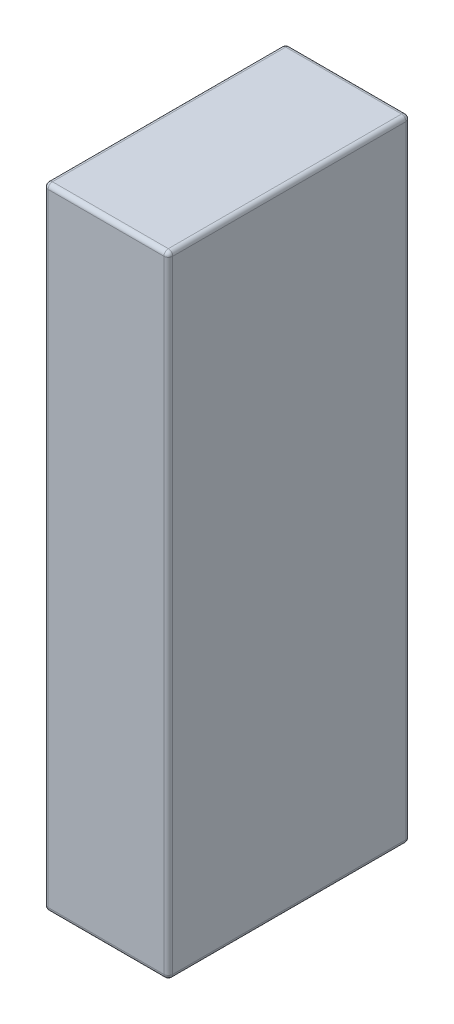
ISO-10303-21;
HEADER;
FILE_DESCRIPTION(('STEP AP214'),'2;1');
FILE_NAME('part.step','',(''),(''),'','','');
FILE_SCHEMA(('AUTOMOTIVE_DESIGN { 1 0 10303 214 1 1 1 1 }'));
ENDSEC;
DATA;
#1=APPLICATION_CONTEXT('core data for automotive mechanical design processes');
#2=APPLICATION_PROTOCOL_DEFINITION('international standard','automotive_design',2000,#1);
#3=PRODUCT_CONTEXT('',#1,'mechanical');
#4=PRODUCT('Part','Part','',(#3));
#5=PRODUCT_RELATED_PRODUCT_CATEGORY('part','',(#4));
#6=PRODUCT_DEFINITION_FORMATION('','',#4);
#7=PRODUCT_DEFINITION_CONTEXT('part definition',#1,'design');
#8=PRODUCT_DEFINITION('design','',#6,#7);
#9=PRODUCT_DEFINITION_SHAPE('','',#8);
#10=(LENGTH_UNIT() NAMED_UNIT(*) SI_UNIT(.MILLI.,.METRE.));
#11=(NAMED_UNIT(*) PLANE_ANGLE_UNIT() SI_UNIT($,.RADIAN.));
#12=(NAMED_UNIT(*) SI_UNIT($,.STERADIAN.) SOLID_ANGLE_UNIT());
#13=UNCERTAINTY_MEASURE_WITH_UNIT(LENGTH_MEASURE(1.E-05),#10,'distance_accuracy_value','');
#14=(GEOMETRIC_REPRESENTATION_CONTEXT(3) GLOBAL_UNCERTAINTY_ASSIGNED_CONTEXT((#13)) GLOBAL_UNIT_ASSIGNED_CONTEXT((#10,
#11,#12)) REPRESENTATION_CONTEXT('',''));
#15=CARTESIAN_POINT('',(0.,0.,0.));
#16=DIRECTION('',(0.,0.,1.));
#17=DIRECTION('',(1.,0.,0.));
#18=AXIS2_PLACEMENT_3D('',#15,#16,#17);
#19=CARTESIAN_POINT('',(-103.506965944272,168.352941176471,165.));
#20=DIRECTION('',(1.,0.,0.));
#21=DIRECTION('',(0.,1.,0.));
#22=AXIS2_PLACEMENT_3D('',#19,#20,#21);
#23=PLANE('',#22);
#24=DIRECTION('',(0.,0.,-1.));
#25=VECTOR('',#24,1.);
#26=CARTESIAN_POINT('',(-103.506965944272,-258.647058823529,165.));
#27=LINE('',#26,#25);
#28=CARTESIAN_POINT('',(-103.506965944272,-258.647058823529,3.));
#29=VERTEX_POINT('',#28);
#30=CARTESIAN_POINT('',(-103.506965944272,-258.647058823529,162.));
#31=VERTEX_POINT('',#30);
#32=EDGE_CURVE('E131',#29,#31,#27,.F.);
#33=ORIENTED_EDGE('',*,*,#32,.T.);
#34=DIRECTION('',(0.,-1.,0.));
#35=VECTOR('',#34,1.);
#36=CARTESIAN_POINT('',(-103.506965944272,168.352941176471,162.));
#37=LINE('',#36,#35);
#38=CARTESIAN_POINT('',(-103.506965944272,165.352941176471,162.));
#39=VERTEX_POINT('',#38);
#40=EDGE_CURVE('E168',#31,#39,#37,.F.);
#41=ORIENTED_EDGE('',*,*,#40,.T.);
#42=DIRECTION('',(0.,0.,-1.));
#43=VECTOR('',#42,1.);
#44=CARTESIAN_POINT('',(-103.506965944272,165.352941176471,165.));
#45=LINE('',#44,#43);
#46=CARTESIAN_POINT('',(-103.506965944272,165.352941176471,3.));
#47=VERTEX_POINT('',#46);
#48=EDGE_CURVE('E165',#39,#47,#45,.T.);
#49=ORIENTED_EDGE('',*,*,#48,.T.);
#50=DIRECTION('',(0.,-1.,0.));
#51=VECTOR('',#50,1.);
#52=CARTESIAN_POINT('',(-103.506965944272,168.352941176471,3.));
#53=LINE('',#52,#51);
#54=EDGE_CURVE('E160',#47,#29,#53,.T.);
#55=ORIENTED_EDGE('',*,*,#54,.T.);
#56=EDGE_LOOP('',(#33,#41,#49,#55));
#57=FACE_BOUND('',#56,.T.);
#58=ADVANCED_FACE('F36',(#57),#23,.F.);
#59=CARTESIAN_POINT('',(-103.506965944272,-261.647058823529,165.));
#60=DIRECTION('',(0.,1.,0.));
#61=DIRECTION('',(0.,0.,1.));
#62=AXIS2_PLACEMENT_3D('',#59,#60,#61);
#63=PLANE('',#62);
#64=DIRECTION('',(0.,0.,-1.));
#65=VECTOR('',#64,1.);
#66=CARTESIAN_POINT('',(-21.5069659442724,-261.647058823529,165.));
#67=LINE('',#66,#65);
#68=CARTESIAN_POINT('',(-21.5069659442724,-261.647058823529,3.));
#69=VERTEX_POINT('',#68);
#70=CARTESIAN_POINT('',(-21.5069659442724,-261.647058823529,162.));
#71=VERTEX_POINT('',#70);
#72=EDGE_CURVE('E153',#69,#71,#67,.F.);
#73=ORIENTED_EDGE('',*,*,#72,.T.);
#74=DIRECTION('',(1.,0.,0.));
#75=VECTOR('',#74,1.);
#76=CARTESIAN_POINT('',(-103.506965944272,-261.647058823529,162.));
#77=LINE('',#76,#75);
#78=CARTESIAN_POINT('',(-100.506965944272,-261.647058823529,162.));
#79=VERTEX_POINT('',#78);
#80=EDGE_CURVE('E157',#71,#79,#77,.F.);
#81=ORIENTED_EDGE('',*,*,#80,.T.);
#82=DIRECTION('',(0.,0.,-1.));
#83=VECTOR('',#82,1.);
#84=CARTESIAN_POINT('',(-100.506965944272,-261.647058823529,165.));
#85=LINE('',#84,#83);
#86=CARTESIAN_POINT('',(-100.506965944272,-261.647058823529,3.));
#87=VERTEX_POINT('',#86);
#88=EDGE_CURVE('E129',#79,#87,#85,.T.);
#89=ORIENTED_EDGE('',*,*,#88,.T.);
#90=DIRECTION('',(1.,0.,0.));
#91=VECTOR('',#90,1.);
#92=CARTESIAN_POINT('',(-103.506965944272,-261.647058823529,3.));
#93=LINE('',#92,#91);
#94=EDGE_CURVE('E147',#87,#69,#93,.T.);
#95=ORIENTED_EDGE('',*,*,#94,.T.);
#96=EDGE_LOOP('',(#73,#81,#89,#95));
#97=FACE_BOUND('',#96,.T.);
#98=ADVANCED_FACE('F155',(#97),#63,.F.);
#99=CARTESIAN_POINT('',(-18.5069659442725,168.352941176471,165.));
#100=DIRECTION('',(-1.,0.,0.));
#101=DIRECTION('',(0.,-1.,0.));
#102=AXIS2_PLACEMENT_3D('',#99,#100,#101);
#103=PLANE('',#102);
#104=DIRECTION('',(0.,0.,-1.));
#105=VECTOR('',#104,1.);
#106=CARTESIAN_POINT('',(-18.5069659442725,165.352941176471,165.));
#107=LINE('',#106,#105);
#108=CARTESIAN_POINT('',(-18.5069659442725,165.352941176471,3.));
#109=VERTEX_POINT('',#108);
#110=CARTESIAN_POINT('',(-18.5069659442725,165.352941176471,162.));
#111=VERTEX_POINT('',#110);
#112=EDGE_CURVE('E172',#109,#111,#107,.F.);
#113=ORIENTED_EDGE('',*,*,#112,.T.);
#114=DIRECTION('',(0.,1.,0.));
#115=VECTOR('',#114,1.);
#116=CARTESIAN_POINT('',(-18.5069659442724,-261.647058823529,162.));
#117=LINE('',#116,#115);
#118=CARTESIAN_POINT('',(-18.5069659442724,-258.647058823529,162.));
#119=VERTEX_POINT('',#118);
#120=EDGE_CURVE('E177',#111,#119,#117,.F.);
#121=ORIENTED_EDGE('',*,*,#120,.T.);
#122=DIRECTION('',(0.,0.,-1.));
#123=VECTOR('',#122,1.);
#124=CARTESIAN_POINT('',(-18.5069659442724,-258.647058823529,165.));
#125=LINE('',#124,#123);
#126=CARTESIAN_POINT('',(-18.5069659442724,-258.647058823529,3.));
#127=VERTEX_POINT('',#126);
#128=EDGE_CURVE('E174',#119,#127,#125,.T.);
#129=ORIENTED_EDGE('',*,*,#128,.T.);
#130=DIRECTION('',(0.,1.,0.));
#131=VECTOR('',#130,1.);
#132=CARTESIAN_POINT('',(-18.5069659442725,168.352941176471,3.));
#133=LINE('',#132,#131);
#134=EDGE_CURVE('E170',#127,#109,#133,.T.);
#135=ORIENTED_EDGE('',*,*,#134,.T.);
#136=EDGE_LOOP('',(#113,#121,#129,#135));
#137=FACE_BOUND('',#136,.T.);
#138=ADVANCED_FACE('F282',(#137),#103,.F.);
#139=CARTESIAN_POINT('',(-103.506965944272,168.352941176471,165.));
#140=DIRECTION('',(0.,-1.,0.));
#141=DIRECTION('',(0.,0.,-1.));
#142=AXIS2_PLACEMENT_3D('',#139,#140,#141);
#143=PLANE('',#142);
#144=DIRECTION('',(0.,0.,-1.));
#145=VECTOR('',#144,1.);
#146=CARTESIAN_POINT('',(-100.506965944272,168.352941176471,165.));
#147=LINE('',#146,#145);
#148=CARTESIAN_POINT('',(-100.506965944272,168.352941176471,3.));
#149=VERTEX_POINT('',#148);
#150=CARTESIAN_POINT('',(-100.506965944272,168.352941176471,162.));
#151=VERTEX_POINT('',#150);
#152=EDGE_CURVE('E181',#149,#151,#147,.F.);
#153=ORIENTED_EDGE('',*,*,#152,.T.);
#154=DIRECTION('',(-1.,0.,0.));
#155=VECTOR('',#154,1.);
#156=CARTESIAN_POINT('',(-18.5069659442725,168.352941176471,162.));
#157=LINE('',#156,#155);
#158=CARTESIAN_POINT('',(-21.5069659442725,168.352941176471,162.));
#159=VERTEX_POINT('',#158);
#160=EDGE_CURVE('E186',#151,#159,#157,.F.);
#161=ORIENTED_EDGE('',*,*,#160,.T.);
#162=DIRECTION('',(0.,0.,-1.));
#163=VECTOR('',#162,1.);
#164=CARTESIAN_POINT('',(-21.5069659442725,168.352941176471,165.));
#165=LINE('',#164,#163);
#166=CARTESIAN_POINT('',(-21.5069659442725,168.352941176471,3.));
#167=VERTEX_POINT('',#166);
#168=EDGE_CURVE('E183',#159,#167,#165,.T.);
#169=ORIENTED_EDGE('',*,*,#168,.T.);
#170=DIRECTION('',(-1.,0.,0.));
#171=VECTOR('',#170,1.);
#172=CARTESIAN_POINT('',(-103.506965944272,168.352941176471,3.));
#173=LINE('',#172,#171);
#174=EDGE_CURVE('E179',#167,#149,#173,.T.);
#175=ORIENTED_EDGE('',*,*,#174,.T.);
#176=EDGE_LOOP('',(#153,#161,#169,#175));
#177=FACE_BOUND('',#176,.T.);
#178=ADVANCED_FACE('F292',(#177),#143,.F.);
#179=CARTESIAN_POINT('',(0.,0.,165.));
#180=DIRECTION('',(0.,0.,1.));
#181=DIRECTION('',(1.,0.,0.));
#182=AXIS2_PLACEMENT_3D('',#179,#180,#181);
#183=PLANE('',#182);
#184=DIRECTION('',(0.,1.,0.));
#185=VECTOR('',#184,1.);
#186=CARTESIAN_POINT('',(-21.5069659442725,168.352941176471,165.));
#187=LINE('',#186,#185);
#188=CARTESIAN_POINT('',(-21.5069659442724,-258.647058823529,165.));
#189=VERTEX_POINT('',#188);
#190=CARTESIAN_POINT('',(-21.5069659442725,165.352941176471,165.));
#191=VERTEX_POINT('',#190);
#192=EDGE_CURVE('E192',#189,#191,#187,.T.);
#193=ORIENTED_EDGE('',*,*,#192,.T.);
#194=DIRECTION('',(-1.,0.,0.));
#195=VECTOR('',#194,1.);
#196=CARTESIAN_POINT('',(-103.506965944272,165.352941176471,165.));
#197=LINE('',#196,#195);
#198=CARTESIAN_POINT('',(-100.506965944272,165.352941176471,165.));
#199=VERTEX_POINT('',#198);
#200=EDGE_CURVE('E194',#191,#199,#197,.T.);
#201=ORIENTED_EDGE('',*,*,#200,.T.);
#202=DIRECTION('',(0.,-1.,0.));
#203=VECTOR('',#202,1.);
#204=CARTESIAN_POINT('',(-100.506965944272,-261.647058823529,165.));
#205=LINE('',#204,#203);
#206=CARTESIAN_POINT('',(-100.506965944272,-258.647058823529,165.));
#207=VERTEX_POINT('',#206);
#208=EDGE_CURVE('E188',#199,#207,#205,.T.);
#209=ORIENTED_EDGE('',*,*,#208,.T.);
#210=DIRECTION('',(1.,0.,0.));
#211=VECTOR('',#210,1.);
#212=CARTESIAN_POINT('',(-18.5069659442724,-258.647058823529,165.));
#213=LINE('',#212,#211);
#214=EDGE_CURVE('E190',#207,#189,#213,.T.);
#215=ORIENTED_EDGE('',*,*,#214,.T.);
#216=EDGE_LOOP('',(#193,#201,#209,#215));
#217=FACE_BOUND('',#216,.T.);
#218=ADVANCED_FACE('F274',(#217),#183,.T.);
#219=CARTESIAN_POINT('',(0.,0.,0.));
#220=DIRECTION('',(0.,0.,1.));
#221=DIRECTION('',(1.,0.,0.));
#222=AXIS2_PLACEMENT_3D('',#219,#220,#221);
#223=PLANE('',#222);
#224=DIRECTION('',(0.,-1.,0.));
#225=VECTOR('',#224,1.);
#226=CARTESIAN_POINT('',(-100.506965944272,0.,0.));
#227=LINE('',#226,#225);
#228=CARTESIAN_POINT('',(-100.506965944272,-258.647058823529,0.));
#229=VERTEX_POINT('',#228);
#230=CARTESIAN_POINT('',(-100.506965944272,165.352941176471,0.));
#231=VERTEX_POINT('',#230);
#232=EDGE_CURVE('E197',#229,#231,#227,.F.);
#233=ORIENTED_EDGE('',*,*,#232,.T.);
#234=DIRECTION('',(-1.,0.,0.));
#235=VECTOR('',#234,1.);
#236=CARTESIAN_POINT('',(0.,165.352941176471,0.));
#237=LINE('',#236,#235);
#238=CARTESIAN_POINT('',(-21.5069659442725,165.352941176471,0.));
#239=VERTEX_POINT('',#238);
#240=EDGE_CURVE('E11',#231,#239,#237,.F.);
#241=ORIENTED_EDGE('',*,*,#240,.T.);
#242=DIRECTION('',(0.,1.,0.));
#243=VECTOR('',#242,1.);
#244=CARTESIAN_POINT('',(-21.5069659442724,0.,0.));
#245=LINE('',#244,#243);
#246=CARTESIAN_POINT('',(-21.5069659442724,-258.647058823529,0.));
#247=VERTEX_POINT('',#246);
#248=EDGE_CURVE('E45',#239,#247,#245,.F.);
#249=ORIENTED_EDGE('',*,*,#248,.T.);
#250=DIRECTION('',(1.,0.,0.));
#251=VECTOR('',#250,1.);
#252=CARTESIAN_POINT('',(0.,-258.647058823529,0.));
#253=LINE('',#252,#251);
#254=EDGE_CURVE('E199',#247,#229,#253,.F.);
#255=ORIENTED_EDGE('',*,*,#254,.T.);
#256=EDGE_LOOP('',(#233,#241,#249,#255));
#257=FACE_BOUND('',#256,.T.);
#258=ADVANCED_FACE('F481',(#257),#223,.F.);
#259=CARTESIAN_POINT('',(-21.5069659442725,165.352941176471,165.));
#260=DIRECTION('',(0.,0.,-1.));
#261=DIRECTION('',(-1.,0.,0.));
#262=AXIS2_PLACEMENT_3D('',#259,#260,#261);
#263=CYLINDRICAL_SURFACE('',#262,3.);
#264=CARTESIAN_POINT('',(-21.5069659442725,165.352941176471,162.));
#265=DIRECTION('',(0.,0.,1.));
#266=DIRECTION('',(1.,0.,0.));
#267=AXIS2_PLACEMENT_3D('',#264,#265,#266);
#268=CIRCLE('',#267,3.);
#269=EDGE_CURVE('E40',#111,#159,#268,.T.);
#270=ORIENTED_EDGE('',*,*,#269,.F.);
#271=ORIENTED_EDGE('',*,*,#112,.F.);
#272=CARTESIAN_POINT('',(-21.5069659442725,165.352941176471,3.));
#273=DIRECTION('',(0.,0.,-1.));
#274=DIRECTION('',(-1.,0.,0.));
#275=AXIS2_PLACEMENT_3D('',#272,#273,#274);
#276=CIRCLE('',#275,3.);
#277=EDGE_CURVE('E252',#167,#109,#276,.T.);
#278=ORIENTED_EDGE('',*,*,#277,.F.);
#279=ORIENTED_EDGE('',*,*,#168,.F.);
#280=EDGE_LOOP('',(#270,#271,#278,#279));
#281=FACE_BOUND('',#280,.T.);
#282=ADVANCED_FACE('F38',(#281),#263,.T.);
#283=CARTESIAN_POINT('',(-21.5069659442725,165.352941176471,162.));
#284=DIRECTION('',(0.,0.,1.));
#285=DIRECTION('',(1.,0.,0.));
#286=AXIS2_PLACEMENT_3D('',#283,#284,#285);
#287=SPHERICAL_SURFACE('',#286,3.);
#288=CARTESIAN_POINT('',(-21.5069659442725,165.352941176471,162.));
#289=DIRECTION('',(0.,1.,0.));
#290=DIRECTION('',(0.,0.,1.));
#291=AXIS2_PLACEMENT_3D('',#288,#289,#290);
#292=CIRCLE('',#291,3.);
#293=EDGE_CURVE('E247',#111,#191,#292,.F.);
#294=ORIENTED_EDGE('',*,*,#293,.F.);
#295=ORIENTED_EDGE('',*,*,#269,.T.);
#296=CARTESIAN_POINT('',(-21.5069659442725,165.352941176471,162.));
#297=DIRECTION('',(1.,0.,0.));
#298=DIRECTION('',(0.,0.,-1.));
#299=AXIS2_PLACEMENT_3D('',#296,#297,#298);
#300=CIRCLE('',#299,3.);
#301=EDGE_CURVE('E250',#191,#159,#300,.F.);
#302=ORIENTED_EDGE('',*,*,#301,.F.);
#303=EDGE_LOOP('',(#294,#295,#302));
#304=FACE_BOUND('',#303,.T.);
#305=ADVANCED_FACE('F262',(#304),#287,.T.);
#306=CARTESIAN_POINT('',(-21.5069659442725,165.352941176471,3.));
#307=DIRECTION('',(0.,0.,1.));
#308=DIRECTION('',(1.,0.,0.));
#309=AXIS2_PLACEMENT_3D('',#306,#307,#308);
#310=SPHERICAL_SURFACE('',#309,3.);
#311=CARTESIAN_POINT('',(-21.5069659442725,165.352941176471,3.));
#312=DIRECTION('',(1.,0.,0.));
#313=DIRECTION('',(0.,1.,0.));
#314=AXIS2_PLACEMENT_3D('',#311,#312,#313);
#315=CIRCLE('',#314,3.);
#316=EDGE_CURVE('E242',#167,#239,#315,.F.);
#317=ORIENTED_EDGE('',*,*,#316,.F.);
#318=ORIENTED_EDGE('',*,*,#277,.T.);
#319=CARTESIAN_POINT('',(-21.5069659442725,165.352941176471,3.));
#320=DIRECTION('',(0.,1.,0.));
#321=DIRECTION('',(0.,0.,1.));
#322=AXIS2_PLACEMENT_3D('',#319,#320,#321);
#323=CIRCLE('',#322,3.);
#324=EDGE_CURVE('E245',#239,#109,#323,.F.);
#325=ORIENTED_EDGE('',*,*,#324,.F.);
#326=EDGE_LOOP('',(#317,#318,#325));
#327=FACE_BOUND('',#326,.T.);
#328=ADVANCED_FACE('F460',(#327),#310,.T.);
#329=CARTESIAN_POINT('',(0.,165.352941176471,162.));
#330=DIRECTION('',(1.,0.,0.));
#331=DIRECTION('',(0.,0.,-1.));
#332=AXIS2_PLACEMENT_3D('',#329,#330,#331);
#333=CYLINDRICAL_SURFACE('',#332,3.);
#334=ORIENTED_EDGE('',*,*,#301,.T.);
#335=ORIENTED_EDGE('',*,*,#160,.F.);
#336=CARTESIAN_POINT('',(-100.506965944272,165.352941176471,162.));
#337=DIRECTION('',(-1.,0.,0.));
#338=DIRECTION('',(0.,0.,1.));
#339=AXIS2_PLACEMENT_3D('',#336,#337,#338);
#340=CIRCLE('',#339,3.);
#341=EDGE_CURVE('E236',#199,#151,#340,.T.);
#342=ORIENTED_EDGE('',*,*,#341,.F.);
#343=ORIENTED_EDGE('',*,*,#200,.F.);
#344=EDGE_LOOP('',(#334,#335,#342,#343));
#345=FACE_BOUND('',#344,.T.);
#346=ADVANCED_FACE('F270',(#345),#333,.T.);
#347=CARTESIAN_POINT('',(-21.5069659442724,0.,162.));
#348=DIRECTION('',(0.,-1.,0.));
#349=DIRECTION('',(1.,0.,0.));
#350=AXIS2_PLACEMENT_3D('',#347,#348,#349);
#351=CYLINDRICAL_SURFACE('',#350,3.);
#352=ORIENTED_EDGE('',*,*,#293,.T.);
#353=ORIENTED_EDGE('',*,*,#192,.F.);
#354=CARTESIAN_POINT('',(-21.5069659442724,-258.647058823529,162.));
#355=DIRECTION('',(0.,-1.,0.));
#356=DIRECTION('',(0.,0.,-1.));
#357=AXIS2_PLACEMENT_3D('',#354,#355,#356);
#358=CIRCLE('',#357,3.);
#359=EDGE_CURVE('E233',#119,#189,#358,.T.);
#360=ORIENTED_EDGE('',*,*,#359,.F.);
#361=ORIENTED_EDGE('',*,*,#120,.F.);
#362=EDGE_LOOP('',(#352,#353,#360,#361));
#363=FACE_BOUND('',#362,.T.);
#364=ADVANCED_FACE('F279',(#363),#351,.T.);
#365=CARTESIAN_POINT('',(-21.5069659442724,-258.647058823529,165.));
#366=DIRECTION('',(0.,0.,-1.));
#367=DIRECTION('',(-1.,0.,0.));
#368=AXIS2_PLACEMENT_3D('',#365,#366,#367);
#369=CYLINDRICAL_SURFACE('',#368,3.);
#370=CARTESIAN_POINT('',(-21.5069659442724,-258.647058823529,3.));
#371=DIRECTION('',(0.,0.,-1.));
#372=DIRECTION('',(-1.,0.,0.));
#373=AXIS2_PLACEMENT_3D('',#370,#371,#372);
#374=CIRCLE('',#373,3.);
#375=EDGE_CURVE('E227',#127,#69,#374,.T.);
#376=ORIENTED_EDGE('',*,*,#375,.F.);
#377=ORIENTED_EDGE('',*,*,#128,.F.);
#378=CARTESIAN_POINT('',(-21.5069659442724,-258.647058823529,162.));
#379=DIRECTION('',(0.,0.,1.));
#380=DIRECTION('',(1.,0.,0.));
#381=AXIS2_PLACEMENT_3D('',#378,#379,#380);
#382=CIRCLE('',#381,3.);
#383=EDGE_CURVE('E230',#71,#119,#382,.T.);
#384=ORIENTED_EDGE('',*,*,#383,.F.);
#385=ORIENTED_EDGE('',*,*,#72,.F.);
#386=EDGE_LOOP('',(#376,#377,#384,#385));
#387=FACE_BOUND('',#386,.T.);
#388=ADVANCED_FACE('F286',(#387),#369,.T.);
#389=CARTESIAN_POINT('',(-21.5069659442725,168.352941176471,3.));
#390=DIRECTION('',(0.,1.,0.));
#391=DIRECTION('',(-1.,0.,0.));
#392=AXIS2_PLACEMENT_3D('',#389,#390,#391);
#393=CYLINDRICAL_SURFACE('',#392,3.);
#394=ORIENTED_EDGE('',*,*,#324,.T.);
#395=ORIENTED_EDGE('',*,*,#134,.F.);
#396=CARTESIAN_POINT('',(-21.5069659442724,-258.647058823529,3.));
#397=DIRECTION('',(0.,-1.,0.));
#398=DIRECTION('',(0.,0.,-1.));
#399=AXIS2_PLACEMENT_3D('',#396,#397,#398);
#400=CIRCLE('',#399,3.);
#401=EDGE_CURVE('E225',#247,#127,#400,.T.);
#402=ORIENTED_EDGE('',*,*,#401,.F.);
#403=ORIENTED_EDGE('',*,*,#248,.F.);
#404=EDGE_LOOP('',(#394,#395,#402,#403));
#405=FACE_BOUND('',#404,.T.);
#406=ADVANCED_FACE('F290',(#405),#393,.T.);
#407=CARTESIAN_POINT('',(-103.506965944272,165.352941176471,3.));
#408=DIRECTION('',(-1.,0.,0.));
#409=DIRECTION('',(0.,0.,1.));
#410=AXIS2_PLACEMENT_3D('',#407,#408,#409);
#411=CYLINDRICAL_SURFACE('',#410,3.);
#412=ORIENTED_EDGE('',*,*,#316,.T.);
#413=ORIENTED_EDGE('',*,*,#240,.F.);
#414=CARTESIAN_POINT('',(-100.506965944272,165.352941176471,3.));
#415=DIRECTION('',(-1.,0.,0.));
#416=DIRECTION('',(0.,0.,1.));
#417=AXIS2_PLACEMENT_3D('',#414,#415,#416);
#418=CIRCLE('',#417,3.);
#419=EDGE_CURVE('E222',#149,#231,#418,.T.);
#420=ORIENTED_EDGE('',*,*,#419,.F.);
#421=ORIENTED_EDGE('',*,*,#174,.F.);
#422=EDGE_LOOP('',(#412,#413,#420,#421));
#423=FACE_BOUND('',#422,.T.);
#424=ADVANCED_FACE('F302',(#423),#411,.T.);
#425=CARTESIAN_POINT('',(-100.506965944272,165.352941176471,165.));
#426=DIRECTION('',(0.,0.,-1.));
#427=DIRECTION('',(-1.,0.,0.));
#428=AXIS2_PLACEMENT_3D('',#425,#426,#427);
#429=CYLINDRICAL_SURFACE('',#428,3.);
#430=CARTESIAN_POINT('',(-100.506965944272,165.352941176471,162.));
#431=DIRECTION('',(0.,0.,1.));
#432=DIRECTION('',(1.,0.,0.));
#433=AXIS2_PLACEMENT_3D('',#430,#431,#432);
#434=CIRCLE('',#433,3.);
#435=EDGE_CURVE('E239',#151,#39,#434,.T.);
#436=ORIENTED_EDGE('',*,*,#435,.F.);
#437=ORIENTED_EDGE('',*,*,#152,.F.);
#438=CARTESIAN_POINT('',(-100.506965944272,165.352941176471,3.));
#439=DIRECTION('',(0.,0.,-1.));
#440=DIRECTION('',(-1.,0.,0.));
#441=AXIS2_PLACEMENT_3D('',#438,#439,#440);
#442=CIRCLE('',#441,3.);
#443=EDGE_CURVE('E219',#47,#149,#442,.T.);
#444=ORIENTED_EDGE('',*,*,#443,.F.);
#445=ORIENTED_EDGE('',*,*,#48,.F.);
#446=EDGE_LOOP('',(#436,#437,#444,#445));
#447=FACE_BOUND('',#446,.T.);
#448=ADVANCED_FACE('F297',(#447),#429,.T.);
#449=CARTESIAN_POINT('',(-100.506965944272,165.352941176471,162.));
#450=DIRECTION('',(0.,0.,1.));
#451=DIRECTION('',(1.,0.,0.));
#452=AXIS2_PLACEMENT_3D('',#449,#450,#451);
#453=SPHERICAL_SURFACE('',#452,3.);
#454=ORIENTED_EDGE('',*,*,#341,.T.);
#455=ORIENTED_EDGE('',*,*,#435,.T.);
#456=CARTESIAN_POINT('',(-100.506965944272,165.352941176471,162.));
#457=DIRECTION('',(0.,1.,0.));
#458=DIRECTION('',(0.,0.,1.));
#459=AXIS2_PLACEMENT_3D('',#456,#457,#458);
#460=CIRCLE('',#459,3.);
#461=EDGE_CURVE('E216',#199,#39,#460,.F.);
#462=ORIENTED_EDGE('',*,*,#461,.F.);
#463=EDGE_LOOP('',(#454,#455,#462));
#464=FACE_BOUND('',#463,.T.);
#465=ADVANCED_FACE('F313',(#464),#453,.T.);
#466=CARTESIAN_POINT('',(-21.5069659442724,-258.647058823529,162.));
#467=DIRECTION('',(0.,0.,1.));
#468=DIRECTION('',(1.,0.,0.));
#469=AXIS2_PLACEMENT_3D('',#466,#467,#468);
#470=SPHERICAL_SURFACE('',#469,3.);
#471=ORIENTED_EDGE('',*,*,#383,.T.);
#472=ORIENTED_EDGE('',*,*,#359,.T.);
#473=CARTESIAN_POINT('',(-21.5069659442724,-258.647058823529,162.));
#474=DIRECTION('',(1.,0.,0.));
#475=DIRECTION('',(0.,0.,-1.));
#476=AXIS2_PLACEMENT_3D('',#473,#474,#475);
#477=CIRCLE('',#476,3.);
#478=EDGE_CURVE('E213',#71,#189,#477,.F.);
#479=ORIENTED_EDGE('',*,*,#478,.F.);
#480=EDGE_LOOP('',(#471,#472,#479));
#481=FACE_BOUND('',#480,.T.);
#482=ADVANCED_FACE('F323',(#481),#470,.T.);
#483=CARTESIAN_POINT('',(-21.5069659442724,-258.647058823529,3.));
#484=DIRECTION('',(0.,0.,1.));
#485=DIRECTION('',(1.,0.,0.));
#486=AXIS2_PLACEMENT_3D('',#483,#484,#485);
#487=SPHERICAL_SURFACE('',#486,3.);
#488=ORIENTED_EDGE('',*,*,#401,.T.);
#489=ORIENTED_EDGE('',*,*,#375,.T.);
#490=CARTESIAN_POINT('',(-21.5069659442724,-258.647058823529,3.));
#491=DIRECTION('',(1.,0.,0.));
#492=DIRECTION('',(0.,0.,-1.));
#493=AXIS2_PLACEMENT_3D('',#490,#491,#492);
#494=CIRCLE('',#493,3.);
#495=EDGE_CURVE('E150',#247,#69,#494,.F.);
#496=ORIENTED_EDGE('',*,*,#495,.F.);
#497=EDGE_LOOP('',(#488,#489,#496));
#498=FACE_BOUND('',#497,.T.);
#499=ADVANCED_FACE('F325',(#498),#487,.T.);
#500=CARTESIAN_POINT('',(-100.506965944272,165.352941176471,3.));
#501=DIRECTION('',(0.,0.,1.));
#502=DIRECTION('',(1.,0.,0.));
#503=AXIS2_PLACEMENT_3D('',#500,#501,#502);
#504=SPHERICAL_SURFACE('',#503,3.);
#505=ORIENTED_EDGE('',*,*,#443,.T.);
#506=ORIENTED_EDGE('',*,*,#419,.T.);
#507=CARTESIAN_POINT('',(-100.506965944272,165.352941176471,3.));
#508=DIRECTION('',(0.,1.,0.));
#509=DIRECTION('',(0.,0.,1.));
#510=AXIS2_PLACEMENT_3D('',#507,#508,#509);
#511=CIRCLE('',#510,3.);
#512=EDGE_CURVE('E209',#47,#231,#511,.F.);
#513=ORIENTED_EDGE('',*,*,#512,.F.);
#514=EDGE_LOOP('',(#505,#506,#513));
#515=FACE_BOUND('',#514,.T.);
#516=ADVANCED_FACE('F304',(#515),#504,.T.);
#517=CARTESIAN_POINT('',(-100.506965944272,0.,162.));
#518=DIRECTION('',(0.,1.,0.));
#519=DIRECTION('',(-1.,0.,0.));
#520=AXIS2_PLACEMENT_3D('',#517,#518,#519);
#521=CYLINDRICAL_SURFACE('',#520,3.);
#522=ORIENTED_EDGE('',*,*,#461,.T.);
#523=ORIENTED_EDGE('',*,*,#40,.F.);
#524=CARTESIAN_POINT('',(-100.506965944272,-258.647058823529,162.));
#525=DIRECTION('',(0.,-1.,0.));
#526=DIRECTION('',(0.,0.,-1.));
#527=AXIS2_PLACEMENT_3D('',#524,#525,#526);
#528=CIRCLE('',#527,3.);
#529=EDGE_CURVE('E206',#207,#31,#528,.T.);
#530=ORIENTED_EDGE('',*,*,#529,.F.);
#531=ORIENTED_EDGE('',*,*,#208,.F.);
#532=EDGE_LOOP('',(#522,#523,#530,#531));
#533=FACE_BOUND('',#532,.T.);
#534=ADVANCED_FACE('F315',(#533),#521,.T.);
#535=CARTESIAN_POINT('',(0.,-258.647058823529,162.));
#536=DIRECTION('',(-1.,0.,0.));
#537=DIRECTION('',(0.,0.,1.));
#538=AXIS2_PLACEMENT_3D('',#535,#536,#537);
#539=CYLINDRICAL_SURFACE('',#538,3.);
#540=ORIENTED_EDGE('',*,*,#478,.T.);
#541=ORIENTED_EDGE('',*,*,#214,.F.);
#542=CARTESIAN_POINT('',(-100.506965944272,-258.647058823529,162.));
#543=DIRECTION('',(-1.,0.,0.));
#544=DIRECTION('',(0.,0.,1.));
#545=AXIS2_PLACEMENT_3D('',#542,#543,#544);
#546=CIRCLE('',#545,3.);
#547=EDGE_CURVE('E144',#79,#207,#546,.T.);
#548=ORIENTED_EDGE('',*,*,#547,.F.);
#549=ORIENTED_EDGE('',*,*,#80,.F.);
#550=EDGE_LOOP('',(#540,#541,#548,#549));
#551=FACE_BOUND('',#550,.T.);
#552=ADVANCED_FACE('F321',(#551),#539,.T.);
#553=CARTESIAN_POINT('',(-103.506965944272,-258.647058823529,3.));
#554=DIRECTION('',(1.,0.,0.));
#555=DIRECTION('',(0.,0.,-1.));
#556=AXIS2_PLACEMENT_3D('',#553,#554,#555);
#557=CYLINDRICAL_SURFACE('',#556,3.);
#558=ORIENTED_EDGE('',*,*,#495,.T.);
#559=ORIENTED_EDGE('',*,*,#94,.F.);
#560=CARTESIAN_POINT('',(-100.506965944272,-258.647058823529,3.));
#561=DIRECTION('',(-1.,0.,0.));
#562=DIRECTION('',(0.,0.,1.));
#563=AXIS2_PLACEMENT_3D('',#560,#561,#562);
#564=CIRCLE('',#563,3.);
#565=EDGE_CURVE('E137',#229,#87,#564,.T.);
#566=ORIENTED_EDGE('',*,*,#565,.F.);
#567=ORIENTED_EDGE('',*,*,#254,.F.);
#568=EDGE_LOOP('',(#558,#559,#566,#567));
#569=FACE_BOUND('',#568,.T.);
#570=ADVANCED_FACE('F148',(#569),#557,.T.);
#571=CARTESIAN_POINT('',(-100.506965944272,168.352941176471,3.));
#572=DIRECTION('',(0.,-1.,0.));
#573=DIRECTION('',(1.,0.,0.));
#574=AXIS2_PLACEMENT_3D('',#571,#572,#573);
#575=CYLINDRICAL_SURFACE('',#574,3.);
#576=ORIENTED_EDGE('',*,*,#512,.T.);
#577=ORIENTED_EDGE('',*,*,#232,.F.);
#578=CARTESIAN_POINT('',(-100.506965944272,-258.647058823529,3.));
#579=DIRECTION('',(0.,-1.,0.));
#580=DIRECTION('',(0.,0.,-1.));
#581=AXIS2_PLACEMENT_3D('',#578,#579,#580);
#582=CIRCLE('',#581,3.);
#583=EDGE_CURVE('E141',#29,#229,#582,.T.);
#584=ORIENTED_EDGE('',*,*,#583,.F.);
#585=ORIENTED_EDGE('',*,*,#54,.F.);
#586=EDGE_LOOP('',(#576,#577,#584,#585));
#587=FACE_BOUND('',#586,.T.);
#588=ADVANCED_FACE('F308',(#587),#575,.T.);
#589=CARTESIAN_POINT('',(-100.506965944272,-258.647058823529,162.));
#590=DIRECTION('',(0.,0.,1.));
#591=DIRECTION('',(1.,0.,0.));
#592=AXIS2_PLACEMENT_3D('',#589,#590,#591);
#593=SPHERICAL_SURFACE('',#592,3.);
#594=ORIENTED_EDGE('',*,*,#547,.T.);
#595=ORIENTED_EDGE('',*,*,#529,.T.);
#596=CARTESIAN_POINT('',(-100.506965944272,-258.647058823529,162.));
#597=DIRECTION('',(0.,0.,1.));
#598=DIRECTION('',(1.,0.,0.));
#599=AXIS2_PLACEMENT_3D('',#596,#597,#598);
#600=CIRCLE('',#599,3.);
#601=EDGE_CURVE('E134',#79,#31,#600,.F.);
#602=ORIENTED_EDGE('',*,*,#601,.F.);
#603=EDGE_LOOP('',(#594,#595,#602));
#604=FACE_BOUND('',#603,.T.);
#605=ADVANCED_FACE('F319',(#604),#593,.T.);
#606=CARTESIAN_POINT('',(-100.506965944272,-258.647058823529,3.));
#607=DIRECTION('',(0.,0.,1.));
#608=DIRECTION('',(1.,0.,0.));
#609=AXIS2_PLACEMENT_3D('',#606,#607,#608);
#610=SPHERICAL_SURFACE('',#609,3.);
#611=ORIENTED_EDGE('',*,*,#583,.T.);
#612=ORIENTED_EDGE('',*,*,#565,.T.);
#613=CARTESIAN_POINT('',(-100.506965944272,-258.647058823529,3.));
#614=DIRECTION('',(0.,0.,-1.));
#615=DIRECTION('',(-1.,0.,0.));
#616=AXIS2_PLACEMENT_3D('',#613,#614,#615);
#617=CIRCLE('',#616,3.);
#618=EDGE_CURVE('E125',#29,#87,#617,.F.);
#619=ORIENTED_EDGE('',*,*,#618,.F.);
#620=EDGE_LOOP('',(#611,#612,#619));
#621=FACE_BOUND('',#620,.T.);
#622=ADVANCED_FACE('F139',(#621),#610,.T.);
#623=CARTESIAN_POINT('',(-100.506965944272,-258.647058823529,165.));
#624=DIRECTION('',(0.,0.,-1.));
#625=DIRECTION('',(-1.,0.,0.));
#626=AXIS2_PLACEMENT_3D('',#623,#624,#625);
#627=CYLINDRICAL_SURFACE('',#626,3.);
#628=ORIENTED_EDGE('',*,*,#601,.T.);
#629=ORIENTED_EDGE('',*,*,#32,.F.);
#630=ORIENTED_EDGE('',*,*,#618,.T.);
#631=ORIENTED_EDGE('',*,*,#88,.F.);
#632=EDGE_LOOP('',(#628,#629,#630,#631));
#633=FACE_BOUND('',#632,.T.);
#634=ADVANCED_FACE('F127',(#633),#627,.T.);
#635=CLOSED_SHELL('',(#58,#98,#138,#178,#218,#258,#282,#305,#328,#346,#364,#388,#406,#424,#448,
#465,#482,#499,#516,#534,#552,#570,#588,#605,#622,#634));
#636=MANIFOLD_SOLID_BREP('B2',#635);
#637=ADVANCED_BREP_SHAPE_REPRESENTATION('',(#18,#636),#14);
#638=SHAPE_DEFINITION_REPRESENTATION(#9,#637);
ENDSEC;
END-ISO-10303-21;
